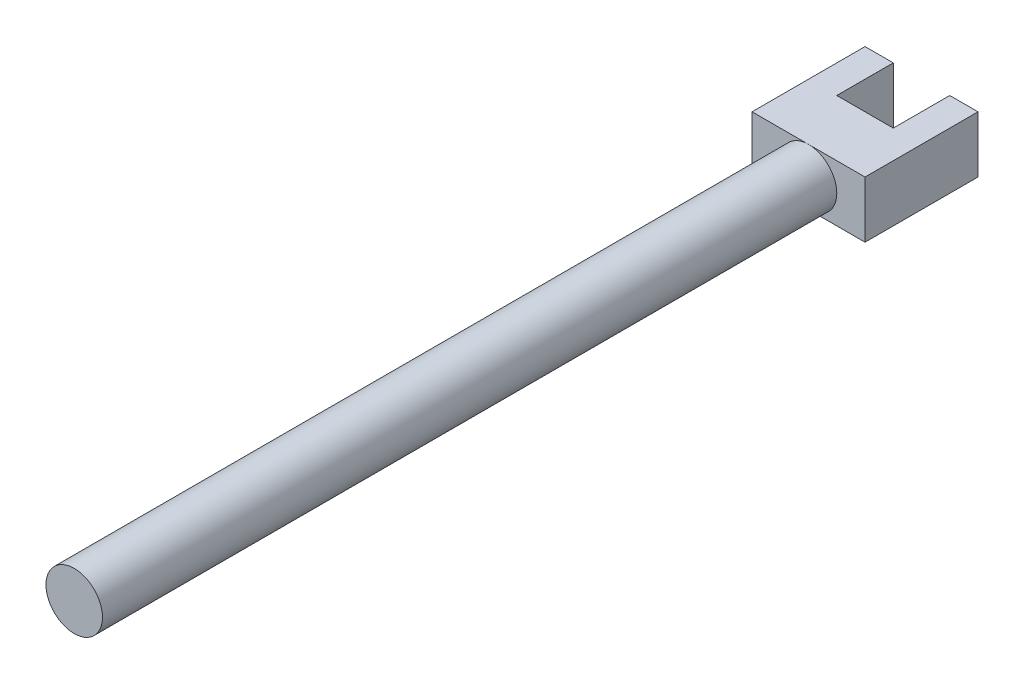
ISO-10303-21;
HEADER;
FILE_DESCRIPTION(('STEP AP214'),'2;1');
FILE_NAME('part.step','',(''),(''),'','','');
FILE_SCHEMA(('AUTOMOTIVE_DESIGN { 1 0 10303 214 1 1 1 1 }'));
ENDSEC;
DATA;
#1=APPLICATION_CONTEXT('core data for automotive mechanical design processes');
#2=APPLICATION_PROTOCOL_DEFINITION('international standard','automotive_design',2000,#1);
#3=PRODUCT_CONTEXT('',#1,'mechanical');
#4=PRODUCT('Part','Part','',(#3));
#5=PRODUCT_RELATED_PRODUCT_CATEGORY('part','',(#4));
#6=PRODUCT_DEFINITION_FORMATION('','',#4);
#7=PRODUCT_DEFINITION_CONTEXT('part definition',#1,'design');
#8=PRODUCT_DEFINITION('design','',#6,#7);
#9=PRODUCT_DEFINITION_SHAPE('','',#8);
#10=(LENGTH_UNIT() NAMED_UNIT(*) SI_UNIT(.MILLI.,.METRE.));
#11=(NAMED_UNIT(*) PLANE_ANGLE_UNIT() SI_UNIT($,.RADIAN.));
#12=(NAMED_UNIT(*) SI_UNIT($,.STERADIAN.) SOLID_ANGLE_UNIT());
#13=UNCERTAINTY_MEASURE_WITH_UNIT(LENGTH_MEASURE(1.E-05),#10,'distance_accuracy_value','');
#14=(GEOMETRIC_REPRESENTATION_CONTEXT(3) GLOBAL_UNCERTAINTY_ASSIGNED_CONTEXT((#13)) GLOBAL_UNIT_ASSIGNED_CONTEXT((#10,
#11,#12)) REPRESENTATION_CONTEXT('',''));
#15=CARTESIAN_POINT('',(0.,0.,0.));
#16=DIRECTION('',(0.,0.,1.));
#17=DIRECTION('',(1.,0.,0.));
#18=AXIS2_PLACEMENT_3D('',#15,#16,#17);
#19=CARTESIAN_POINT('',(-10.,5.,-10.));
#20=DIRECTION('',(0.,0.,1.));
#21=DIRECTION('',(1.,0.,0.));
#22=AXIS2_PLACEMENT_3D('',#19,#20,#21);
#23=PLANE('',#22);
#24=DIRECTION('',(0.,-1.,0.));
#25=VECTOR('',#24,1.);
#26=CARTESIAN_POINT('',(-5.,5.,-10.));
#27=LINE('',#26,#25);
#28=CARTESIAN_POINT('',(-5.,5.,-10.));
#29=VERTEX_POINT('',#28);
#30=CARTESIAN_POINT('',(-5.,-5.,-10.));
#31=VERTEX_POINT('',#30);
#32=EDGE_CURVE('E53',#29,#31,#27,.T.);
#33=ORIENTED_EDGE('',*,*,#32,.F.);
#34=DIRECTION('',(1.,0.,0.));
#35=VECTOR('',#34,1.);
#36=CARTESIAN_POINT('',(10.,5.,-10.));
#37=LINE('',#36,#35);
#38=CARTESIAN_POINT('',(5.,5.,-10.));
#39=VERTEX_POINT('',#38);
#40=EDGE_CURVE('E39',#29,#39,#37,.T.);
#41=ORIENTED_EDGE('',*,*,#40,.T.);
#42=DIRECTION('',(0.,1.,0.));
#43=VECTOR('',#42,1.);
#44=CARTESIAN_POINT('',(5.,5.,-10.));
#45=LINE('',#44,#43);
#46=CARTESIAN_POINT('',(5.,-5.,-10.));
#47=VERTEX_POINT('',#46);
#48=EDGE_CURVE('E142',#47,#39,#45,.T.);
#49=ORIENTED_EDGE('',*,*,#48,.F.);
#50=DIRECTION('',(-1.,0.,0.));
#51=VECTOR('',#50,1.);
#52=CARTESIAN_POINT('',(10.,-5.,-10.));
#53=LINE('',#52,#51);
#54=EDGE_CURVE('E58',#47,#31,#53,.T.);
#55=ORIENTED_EDGE('',*,*,#54,.T.);
#56=EDGE_LOOP('',(#33,#41,#49,#55));
#57=FACE_BOUND('',#56,.T.);
#58=ADVANCED_FACE('F35',(#57),#23,.F.);
#59=CARTESIAN_POINT('',(0.,0.,130.));
#60=DIRECTION('',(0.,0.,-1.));
#61=DIRECTION('',(-1.,0.,0.));
#62=AXIS2_PLACEMENT_3D('',#59,#60,#61);
#63=CYLINDRICAL_SURFACE('',#62,5.);
#64=CARTESIAN_POINT('',(0.,0.,130.));
#65=DIRECTION('',(0.,0.,1.));
#66=DIRECTION('',(1.,0.,0.));
#67=AXIS2_PLACEMENT_3D('',#64,#65,#66);
#68=CIRCLE('',#67,5.);
#69=CARTESIAN_POINT('',(5.,0.,130.));
#70=VERTEX_POINT('',#69);
#71=EDGE_CURVE('E11',#70,#70,#68,.T.);
#72=ORIENTED_EDGE('',*,*,#71,.F.);
#73=EDGE_LOOP('',(#72));
#74=FACE_BOUND('',#73,.T.);
#75=CARTESIAN_POINT('',(0.,0.,0.));
#76=DIRECTION('',(0.,0.,1.));
#77=DIRECTION('',(1.,0.,0.));
#78=AXIS2_PLACEMENT_3D('',#75,#76,#77);
#79=CIRCLE('',#78,5.);
#80=CARTESIAN_POINT('',(0.,5.,0.));
#81=VERTEX_POINT('',#80);
#82=CARTESIAN_POINT('',(0.,-5.,0.));
#83=VERTEX_POINT('',#82);
#84=EDGE_CURVE('E45',#81,#83,#79,.T.);
#85=ORIENTED_EDGE('',*,*,#84,.T.);
#86=EDGE_CURVE('E117',#83,#81,#79,.T.);
#87=ORIENTED_EDGE('',*,*,#86,.T.);
#88=EDGE_LOOP('',(#85,#87));
#89=FACE_BOUND('',#88,.T.);
#90=ADVANCED_FACE('F37',(#74,#89),#63,.T.);
#91=CARTESIAN_POINT('',(0.,0.,130.));
#92=DIRECTION('',(0.,0.,1.));
#93=DIRECTION('',(1.,0.,0.));
#94=AXIS2_PLACEMENT_3D('',#91,#92,#93);
#95=PLANE('',#94);
#96=ORIENTED_EDGE('',*,*,#71,.T.);
#97=EDGE_LOOP('',(#96));
#98=FACE_BOUND('',#97,.T.);
#99=ADVANCED_FACE('F229',(#98),#95,.T.);
#100=CARTESIAN_POINT('',(-10.,5.,0.));
#101=DIRECTION('',(0.,0.,1.));
#102=DIRECTION('',(1.,0.,0.));
#103=AXIS2_PLACEMENT_3D('',#100,#101,#102);
#104=PLANE('',#103);
#105=ORIENTED_EDGE('',*,*,#84,.F.);
#106=DIRECTION('',(1.,0.,0.));
#107=VECTOR('',#106,1.);
#108=CARTESIAN_POINT('',(10.,5.,0.));
#109=LINE('',#108,#107);
#110=CARTESIAN_POINT('',(-10.,5.,0.));
#111=VERTEX_POINT('',#110);
#112=EDGE_CURVE('E174',#111,#81,#109,.T.);
#113=ORIENTED_EDGE('',*,*,#112,.F.);
#114=DIRECTION('',(0.,1.,0.));
#115=VECTOR('',#114,1.);
#116=CARTESIAN_POINT('',(-10.,-5.,0.));
#117=LINE('',#116,#115);
#118=CARTESIAN_POINT('',(-10.,-5.,0.));
#119=VERTEX_POINT('',#118);
#120=EDGE_CURVE('E115',#119,#111,#117,.T.);
#121=ORIENTED_EDGE('',*,*,#120,.F.);
#122=DIRECTION('',(-1.,0.,0.));
#123=VECTOR('',#122,1.);
#124=CARTESIAN_POINT('',(10.,-5.,0.));
#125=LINE('',#124,#123);
#126=EDGE_CURVE('E180',#83,#119,#125,.T.);
#127=ORIENTED_EDGE('',*,*,#126,.F.);
#128=EDGE_LOOP('',(#105,#113,#121,#127));
#129=FACE_BOUND('',#128,.T.);
#130=ADVANCED_FACE('F201',(#129),#104,.T.);
#131=ORIENTED_EDGE('',*,*,#86,.F.);
#132=CARTESIAN_POINT('',(10.,-5.,0.));
#133=VERTEX_POINT('',#132);
#134=EDGE_CURVE('E181',#133,#83,#125,.T.);
#135=ORIENTED_EDGE('',*,*,#134,.F.);
#136=DIRECTION('',(0.,-1.,0.));
#137=VECTOR('',#136,1.);
#138=CARTESIAN_POINT('',(10.,-5.,0.));
#139=LINE('',#138,#137);
#140=CARTESIAN_POINT('',(10.,5.,0.));
#141=VERTEX_POINT('',#140);
#142=EDGE_CURVE('E178',#141,#133,#139,.T.);
#143=ORIENTED_EDGE('',*,*,#142,.F.);
#144=EDGE_CURVE('E172',#81,#141,#109,.T.);
#145=ORIENTED_EDGE('',*,*,#144,.F.);
#146=EDGE_LOOP('',(#131,#135,#143,#145));
#147=FACE_BOUND('',#146,.T.);
#148=ADVANCED_FACE('F198',(#147),#104,.T.);
#149=CARTESIAN_POINT('',(-10.,-5.,-10.));
#150=DIRECTION('',(1.,0.,0.));
#151=DIRECTION('',(0.,0.,-1.));
#152=AXIS2_PLACEMENT_3D('',#149,#150,#151);
#153=PLANE('',#152);
#154=ORIENTED_EDGE('',*,*,#120,.T.);
#155=DIRECTION('',(0.,0.,1.));
#156=VECTOR('',#155,1.);
#157=CARTESIAN_POINT('',(-10.,5.,-10.));
#158=LINE('',#157,#156);
#159=CARTESIAN_POINT('',(-10.,5.,-20.));
#160=VERTEX_POINT('',#159);
#161=EDGE_CURVE('E108',#160,#111,#158,.T.);
#162=ORIENTED_EDGE('',*,*,#161,.F.);
#163=DIRECTION('',(0.,1.,0.));
#164=VECTOR('',#163,1.);
#165=CARTESIAN_POINT('',(-10.,5.,-20.));
#166=LINE('',#165,#164);
#167=CARTESIAN_POINT('',(-10.,-5.,-20.));
#168=VERTEX_POINT('',#167);
#169=EDGE_CURVE('E113',#168,#160,#166,.T.);
#170=ORIENTED_EDGE('',*,*,#169,.F.);
#171=DIRECTION('',(0.,0.,1.));
#172=VECTOR('',#171,1.);
#173=CARTESIAN_POINT('',(-10.,-5.,-10.));
#174=LINE('',#173,#172);
#175=EDGE_CURVE('E184',#168,#119,#174,.T.);
#176=ORIENTED_EDGE('',*,*,#175,.T.);
#177=EDGE_LOOP('',(#154,#162,#170,#176));
#178=FACE_BOUND('',#177,.T.);
#179=ADVANCED_FACE('F110',(#178),#153,.F.);
#180=CARTESIAN_POINT('',(10.,5.,-10.));
#181=DIRECTION('',(0.,-1.,0.));
#182=DIRECTION('',(0.,0.,-1.));
#183=AXIS2_PLACEMENT_3D('',#180,#181,#182);
#184=PLANE('',#183);
#185=ORIENTED_EDGE('',*,*,#112,.T.);
#186=ORIENTED_EDGE('',*,*,#144,.T.);
#187=DIRECTION('',(0.,0.,1.));
#188=VECTOR('',#187,1.);
#189=CARTESIAN_POINT('',(10.,5.,-10.));
#190=LINE('',#189,#188);
#191=CARTESIAN_POINT('',(10.,5.,-20.));
#192=VERTEX_POINT('',#191);
#193=EDGE_CURVE('E118',#192,#141,#190,.T.);
#194=ORIENTED_EDGE('',*,*,#193,.F.);
#195=DIRECTION('',(1.,0.,0.));
#196=VECTOR('',#195,1.);
#197=CARTESIAN_POINT('',(10.,5.,-20.));
#198=LINE('',#197,#196);
#199=CARTESIAN_POINT('',(5.,5.,-20.));
#200=VERTEX_POINT('',#199);
#201=EDGE_CURVE('E150',#200,#192,#198,.T.);
#202=ORIENTED_EDGE('',*,*,#201,.F.);
#203=DIRECTION('',(0.,0.,1.));
#204=VECTOR('',#203,1.);
#205=CARTESIAN_POINT('',(5.,5.,-20.));
#206=LINE('',#205,#204);
#207=EDGE_CURVE('E153',#200,#39,#206,.T.);
#208=ORIENTED_EDGE('',*,*,#207,.T.);
#209=ORIENTED_EDGE('',*,*,#40,.F.);
#210=DIRECTION('',(0.,0.,1.));
#211=VECTOR('',#210,1.);
#212=CARTESIAN_POINT('',(-5.,5.,-20.));
#213=LINE('',#212,#211);
#214=CARTESIAN_POINT('',(-5.,5.,-20.));
#215=VERTEX_POINT('',#214);
#216=EDGE_CURVE('E124',#215,#29,#213,.T.);
#217=ORIENTED_EDGE('',*,*,#216,.F.);
#218=DIRECTION('',(1.,0.,0.));
#219=VECTOR('',#218,1.);
#220=CARTESIAN_POINT('',(-10.,5.,-20.));
#221=LINE('',#220,#219);
#222=EDGE_CURVE('E121',#160,#215,#221,.T.);
#223=ORIENTED_EDGE('',*,*,#222,.F.);
#224=ORIENTED_EDGE('',*,*,#161,.T.);
#225=EDGE_LOOP('',(#185,#186,#194,#202,#208,#209,#217,#223,#224));
#226=FACE_BOUND('',#225,.T.);
#227=ADVANCED_FACE('F122',(#226),#184,.F.);
#228=CARTESIAN_POINT('',(10.,-5.,-10.));
#229=DIRECTION('',(-1.,0.,0.));
#230=DIRECTION('',(0.,0.,1.));
#231=AXIS2_PLACEMENT_3D('',#228,#229,#230);
#232=PLANE('',#231);
#233=ORIENTED_EDGE('',*,*,#142,.T.);
#234=DIRECTION('',(0.,0.,1.));
#235=VECTOR('',#234,1.);
#236=CARTESIAN_POINT('',(10.,-5.,-10.));
#237=LINE('',#236,#235);
#238=CARTESIAN_POINT('',(10.,-5.,-20.));
#239=VERTEX_POINT('',#238);
#240=EDGE_CURVE('E186',#239,#133,#237,.T.);
#241=ORIENTED_EDGE('',*,*,#240,.F.);
#242=DIRECTION('',(0.,-1.,0.));
#243=VECTOR('',#242,1.);
#244=CARTESIAN_POINT('',(10.,5.,-20.));
#245=LINE('',#244,#243);
#246=EDGE_CURVE('E143',#192,#239,#245,.T.);
#247=ORIENTED_EDGE('',*,*,#246,.F.);
#248=ORIENTED_EDGE('',*,*,#193,.T.);
#249=EDGE_LOOP('',(#233,#241,#247,#248));
#250=FACE_BOUND('',#249,.T.);
#251=ADVANCED_FACE('F207',(#250),#232,.F.);
#252=CARTESIAN_POINT('',(10.,-5.,-10.));
#253=DIRECTION('',(0.,1.,0.));
#254=DIRECTION('',(0.,0.,1.));
#255=AXIS2_PLACEMENT_3D('',#252,#253,#254);
#256=PLANE('',#255);
#257=ORIENTED_EDGE('',*,*,#134,.T.);
#258=ORIENTED_EDGE('',*,*,#126,.T.);
#259=ORIENTED_EDGE('',*,*,#175,.F.);
#260=DIRECTION('',(-1.,0.,0.));
#261=VECTOR('',#260,1.);
#262=CARTESIAN_POINT('',(-10.,-5.,-20.));
#263=LINE('',#262,#261);
#264=CARTESIAN_POINT('',(-5.,-5.,-20.));
#265=VERTEX_POINT('',#264);
#266=EDGE_CURVE('E132',#265,#168,#263,.T.);
#267=ORIENTED_EDGE('',*,*,#266,.F.);
#268=DIRECTION('',(0.,0.,1.));
#269=VECTOR('',#268,1.);
#270=CARTESIAN_POINT('',(-5.,-5.,-20.));
#271=LINE('',#270,#269);
#272=EDGE_CURVE('E137',#265,#31,#271,.T.);
#273=ORIENTED_EDGE('',*,*,#272,.T.);
#274=ORIENTED_EDGE('',*,*,#54,.F.);
#275=DIRECTION('',(0.,0.,1.));
#276=VECTOR('',#275,1.);
#277=CARTESIAN_POINT('',(5.,-5.,-20.));
#278=LINE('',#277,#276);
#279=CARTESIAN_POINT('',(5.,-5.,-20.));
#280=VERTEX_POINT('',#279);
#281=EDGE_CURVE('E164',#280,#47,#278,.T.);
#282=ORIENTED_EDGE('',*,*,#281,.F.);
#283=DIRECTION('',(-1.,0.,0.));
#284=VECTOR('',#283,1.);
#285=CARTESIAN_POINT('',(10.,-5.,-20.));
#286=LINE('',#285,#284);
#287=EDGE_CURVE('E146',#239,#280,#286,.T.);
#288=ORIENTED_EDGE('',*,*,#287,.F.);
#289=ORIENTED_EDGE('',*,*,#240,.T.);
#290=EDGE_LOOP('',(#257,#258,#259,#267,#273,#274,#282,#288,#289));
#291=FACE_BOUND('',#290,.T.);
#292=ADVANCED_FACE('F203',(#291),#256,.F.);
#293=CARTESIAN_POINT('',(5.,5.,-20.));
#294=DIRECTION('',(1.,0.,0.));
#295=DIRECTION('',(0.,1.,0.));
#296=AXIS2_PLACEMENT_3D('',#293,#294,#295);
#297=PLANE('',#296);
#298=ORIENTED_EDGE('',*,*,#48,.T.);
#299=ORIENTED_EDGE('',*,*,#207,.F.);
#300=DIRECTION('',(0.,1.,0.));
#301=VECTOR('',#300,1.);
#302=CARTESIAN_POINT('',(5.,5.,-20.));
#303=LINE('',#302,#301);
#304=EDGE_CURVE('E148',#280,#200,#303,.T.);
#305=ORIENTED_EDGE('',*,*,#304,.F.);
#306=ORIENTED_EDGE('',*,*,#281,.T.);
#307=EDGE_LOOP('',(#298,#299,#305,#306));
#308=FACE_BOUND('',#307,.T.);
#309=ADVANCED_FACE('F212',(#308),#297,.F.);
#310=CARTESIAN_POINT('',(10.,-5.,-20.));
#311=DIRECTION('',(0.,0.,-1.));
#312=DIRECTION('',(-1.,0.,0.));
#313=AXIS2_PLACEMENT_3D('',#310,#311,#312);
#314=PLANE('',#313);
#315=ORIENTED_EDGE('',*,*,#246,.T.);
#316=ORIENTED_EDGE('',*,*,#287,.T.);
#317=ORIENTED_EDGE('',*,*,#304,.T.);
#318=ORIENTED_EDGE('',*,*,#201,.T.);
#319=EDGE_LOOP('',(#315,#316,#317,#318));
#320=FACE_BOUND('',#319,.T.);
#321=ADVANCED_FACE('F210',(#320),#314,.T.);
#322=CARTESIAN_POINT('',(-5.,5.,-20.));
#323=DIRECTION('',(-1.,0.,0.));
#324=DIRECTION('',(0.,-1.,0.));
#325=AXIS2_PLACEMENT_3D('',#322,#323,#324);
#326=PLANE('',#325);
#327=ORIENTED_EDGE('',*,*,#32,.T.);
#328=ORIENTED_EDGE('',*,*,#272,.F.);
#329=DIRECTION('',(0.,-1.,0.));
#330=VECTOR('',#329,1.);
#331=CARTESIAN_POINT('',(-5.,5.,-20.));
#332=LINE('',#331,#330);
#333=EDGE_CURVE('E127',#215,#265,#332,.T.);
#334=ORIENTED_EDGE('',*,*,#333,.F.);
#335=ORIENTED_EDGE('',*,*,#216,.T.);
#336=EDGE_LOOP('',(#327,#328,#334,#335));
#337=FACE_BOUND('',#336,.T.);
#338=ADVANCED_FACE('F214',(#337),#326,.F.);
#339=CARTESIAN_POINT('',(-10.,-5.,-20.));
#340=DIRECTION('',(0.,0.,1.));
#341=DIRECTION('',(1.,0.,0.));
#342=AXIS2_PLACEMENT_3D('',#339,#340,#341);
#343=PLANE('',#342);
#344=ORIENTED_EDGE('',*,*,#169,.T.);
#345=ORIENTED_EDGE('',*,*,#222,.T.);
#346=ORIENTED_EDGE('',*,*,#333,.T.);
#347=ORIENTED_EDGE('',*,*,#266,.T.);
#348=EDGE_LOOP('',(#344,#345,#346,#347));
#349=FACE_BOUND('',#348,.T.);
#350=ADVANCED_FACE('F130',(#349),#343,.F.);
#351=CLOSED_SHELL('',(#58,#90,#99,#130,#148,#179,#227,#251,#292,#309,#321,#338,#350));
#352=MANIFOLD_SOLID_BREP('B2',#351);
#353=ADVANCED_BREP_SHAPE_REPRESENTATION('',(#18,#352),#14);
#354=SHAPE_DEFINITION_REPRESENTATION(#9,#353);
ENDSEC;
END-ISO-10303-21;
